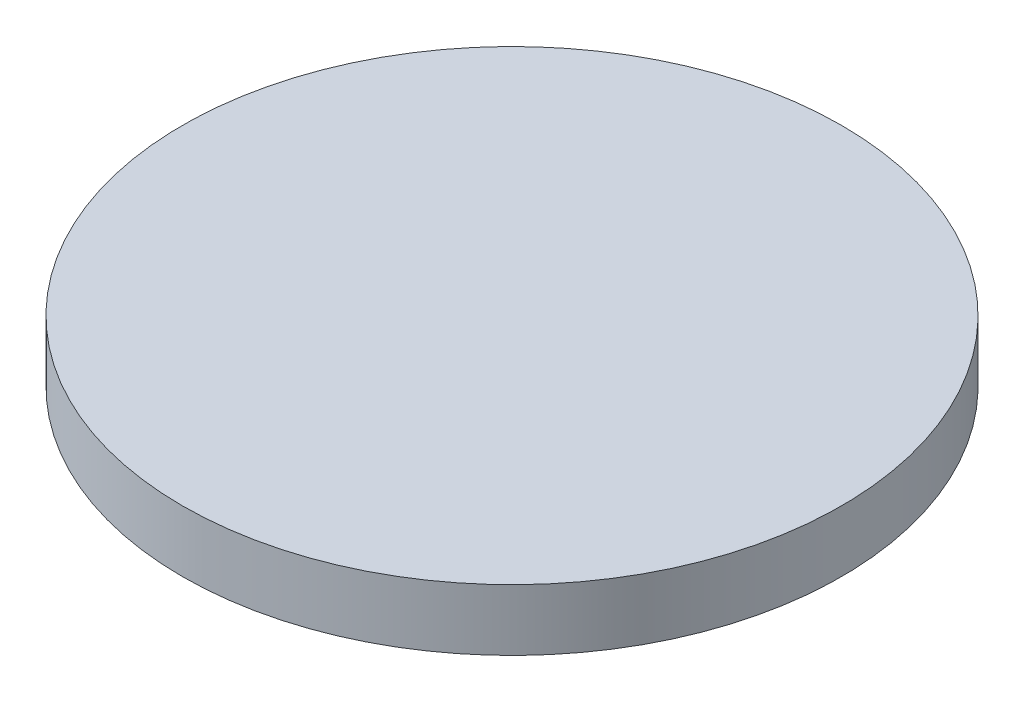
ISO-10303-21;
HEADER;
FILE_DESCRIPTION(('STEP AP214'),'2;1');
FILE_NAME('part.step','',(''),(''),'','','');
FILE_SCHEMA(('AUTOMOTIVE_DESIGN { 1 0 10303 214 1 1 1 1 }'));
ENDSEC;
DATA;
#1=APPLICATION_CONTEXT('core data for automotive mechanical design processes');
#2=APPLICATION_PROTOCOL_DEFINITION('international standard','automotive_design',2000,#1);
#3=PRODUCT_CONTEXT('',#1,'mechanical');
#4=PRODUCT('Part','Part','',(#3));
#5=PRODUCT_RELATED_PRODUCT_CATEGORY('part','',(#4));
#6=PRODUCT_DEFINITION_FORMATION('','',#4);
#7=PRODUCT_DEFINITION_CONTEXT('part definition',#1,'design');
#8=PRODUCT_DEFINITION('design','',#6,#7);
#9=PRODUCT_DEFINITION_SHAPE('','',#8);
#10=(LENGTH_UNIT() NAMED_UNIT(*) SI_UNIT(.MILLI.,.METRE.));
#11=(NAMED_UNIT(*) PLANE_ANGLE_UNIT() SI_UNIT($,.RADIAN.));
#12=(NAMED_UNIT(*) SI_UNIT($,.STERADIAN.) SOLID_ANGLE_UNIT());
#13=UNCERTAINTY_MEASURE_WITH_UNIT(LENGTH_MEASURE(1.E-05),#10,'distance_accuracy_value','');
#14=(GEOMETRIC_REPRESENTATION_CONTEXT(3) GLOBAL_UNCERTAINTY_ASSIGNED_CONTEXT((#13)) GLOBAL_UNIT_ASSIGNED_CONTEXT((#10,
#11,#12)) REPRESENTATION_CONTEXT('',''));
#15=CARTESIAN_POINT('',(0.,0.,0.));
#16=DIRECTION('',(0.,0.,1.));
#17=DIRECTION('',(1.,0.,0.));
#18=AXIS2_PLACEMENT_3D('',#15,#16,#17);
#19=CARTESIAN_POINT('',(0.,4.,0.));
#20=DIRECTION('',(0.,-1.,0.));
#21=DIRECTION('',(0.,0.,-1.));
#22=AXIS2_PLACEMENT_3D('',#19,#20,#21);
#23=CYLINDRICAL_SURFACE('',#22,21.5);
#24=CARTESIAN_POINT('',(0.,4.,0.));
#25=DIRECTION('',(0.,1.,0.));
#26=DIRECTION('',(0.,0.,1.));
#27=AXIS2_PLACEMENT_3D('',#24,#25,#26);
#28=CIRCLE('',#27,21.5);
#29=CARTESIAN_POINT('',(0.,4.,21.5));
#30=VERTEX_POINT('',#29);
#31=EDGE_CURVE('E10',#30,#30,#28,.T.);
#32=ORIENTED_EDGE('',*,*,#31,.F.);
#33=EDGE_LOOP('',(#32));
#34=FACE_BOUND('',#33,.T.);
#35=CARTESIAN_POINT('',(0.,0.,0.));
#36=DIRECTION('',(0.,1.,0.));
#37=DIRECTION('',(0.,0.,1.));
#38=AXIS2_PLACEMENT_3D('',#35,#36,#37);
#39=CIRCLE('',#38,21.5);
#40=CARTESIAN_POINT('',(0.,0.,21.5));
#41=VERTEX_POINT('',#40);
#42=EDGE_CURVE('E38',#41,#41,#39,.T.);
#43=ORIENTED_EDGE('',*,*,#42,.T.);
#44=EDGE_LOOP('',(#43));
#45=FACE_BOUND('',#44,.T.);
#46=ADVANCED_FACE('F35',(#34,#45),#23,.T.);
#47=CARTESIAN_POINT('',(0.,4.,0.));
#48=DIRECTION('',(0.,1.,0.));
#49=DIRECTION('',(0.,0.,1.));
#50=AXIS2_PLACEMENT_3D('',#47,#48,#49);
#51=PLANE('',#50);
#52=ORIENTED_EDGE('',*,*,#31,.T.);
#53=EDGE_LOOP('',(#52));
#54=FACE_BOUND('',#53,.T.);
#55=ADVANCED_FACE('F50',(#54),#51,.T.);
#56=CARTESIAN_POINT('',(0.,0.,0.));
#57=DIRECTION('',(0.,1.,0.));
#58=DIRECTION('',(0.,0.,1.));
#59=AXIS2_PLACEMENT_3D('',#56,#57,#58);
#60=PLANE('',#59);
#61=ORIENTED_EDGE('',*,*,#42,.F.);
#62=EDGE_LOOP('',(#61));
#63=FACE_BOUND('',#62,.T.);
#64=ADVANCED_FACE('F48',(#63),#60,.F.);
#65=CLOSED_SHELL('',(#46,#55,#64));
#66=MANIFOLD_SOLID_BREP('B2',#65);
#67=ADVANCED_BREP_SHAPE_REPRESENTATION('',(#18,#66),#14);
#68=SHAPE_DEFINITION_REPRESENTATION(#9,#67);
ENDSEC;
END-ISO-10303-21;
